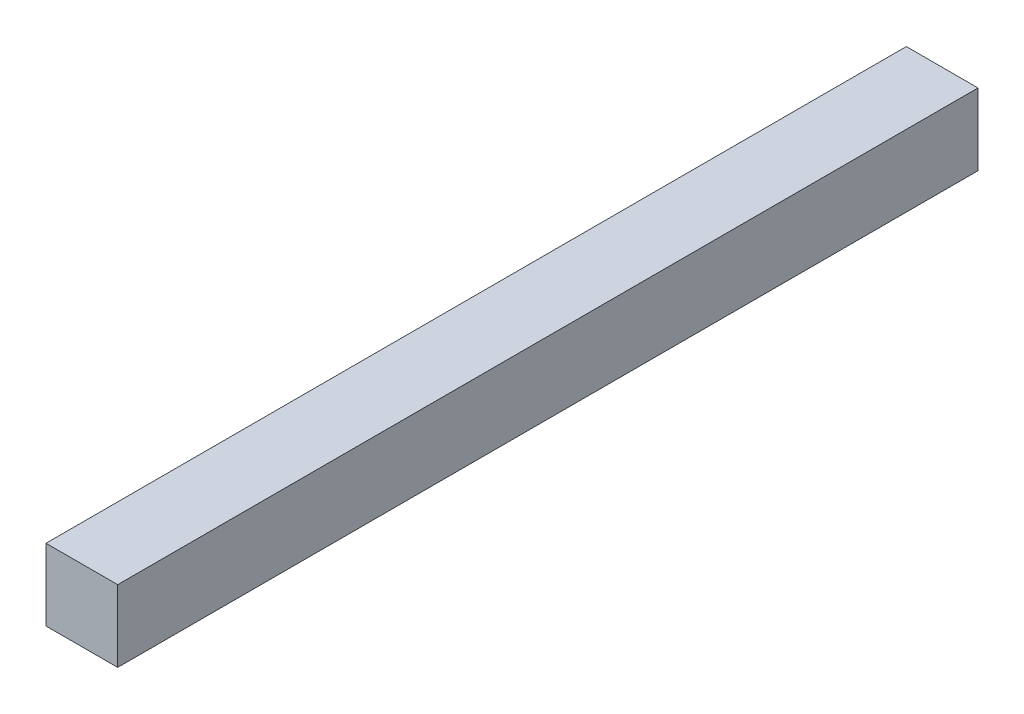
ISO-10303-21;
HEADER;
FILE_DESCRIPTION(('STEP AP214'),'2;1');
FILE_NAME('part.step','',(''),(''),'','','');
FILE_SCHEMA(('AUTOMOTIVE_DESIGN { 1 0 10303 214 1 1 1 1 }'));
ENDSEC;
DATA;
#1=APPLICATION_CONTEXT('core data for automotive mechanical design processes');
#2=APPLICATION_PROTOCOL_DEFINITION('international standard','automotive_design',2000,#1);
#3=PRODUCT_CONTEXT('',#1,'mechanical');
#4=PRODUCT('Part','Part','',(#3));
#5=PRODUCT_RELATED_PRODUCT_CATEGORY('part','',(#4));
#6=PRODUCT_DEFINITION_FORMATION('','',#4);
#7=PRODUCT_DEFINITION_CONTEXT('part definition',#1,'design');
#8=PRODUCT_DEFINITION('design','',#6,#7);
#9=PRODUCT_DEFINITION_SHAPE('','',#8);
#10=(LENGTH_UNIT() NAMED_UNIT(*) SI_UNIT(.MILLI.,.METRE.));
#11=(NAMED_UNIT(*) PLANE_ANGLE_UNIT() SI_UNIT($,.RADIAN.));
#12=(NAMED_UNIT(*) SI_UNIT($,.STERADIAN.) SOLID_ANGLE_UNIT());
#13=UNCERTAINTY_MEASURE_WITH_UNIT(LENGTH_MEASURE(1.E-05),#10,'distance_accuracy_value','');
#14=(GEOMETRIC_REPRESENTATION_CONTEXT(3) GLOBAL_UNCERTAINTY_ASSIGNED_CONTEXT((#13)) GLOBAL_UNIT_ASSIGNED_CONTEXT((#10,
#11,#12)) REPRESENTATION_CONTEXT('',''));
#15=CARTESIAN_POINT('',(0.,0.,0.));
#16=DIRECTION('',(0.,0.,1.));
#17=DIRECTION('',(1.,0.,0.));
#18=AXIS2_PLACEMENT_3D('',#15,#16,#17);
#19=CARTESIAN_POINT('',(-2.5,-2.5,60.));
#20=DIRECTION('',(1.,0.,0.));
#21=DIRECTION('',(0.,0.,-1.));
#22=AXIS2_PLACEMENT_3D('',#19,#20,#21);
#23=PLANE('',#22);
#24=DIRECTION('',(0.,-1.,0.));
#25=VECTOR('',#24,1.);
#26=CARTESIAN_POINT('',(-2.5,-2.5,0.));
#27=LINE('',#26,#25);
#28=CARTESIAN_POINT('',(-2.5,2.5,0.));
#29=VERTEX_POINT('',#28);
#30=CARTESIAN_POINT('',(-2.5,-2.5,0.));
#31=VERTEX_POINT('',#30);
#32=EDGE_CURVE('E113',#29,#31,#27,.T.);
#33=ORIENTED_EDGE('',*,*,#32,.T.);
#34=DIRECTION('',(0.,0.,-1.));
#35=VECTOR('',#34,1.);
#36=CARTESIAN_POINT('',(-2.5,-2.5,60.));
#37=LINE('',#36,#35);
#38=CARTESIAN_POINT('',(-2.5,-2.5,60.));
#39=VERTEX_POINT('',#38);
#40=EDGE_CURVE('E11',#39,#31,#37,.T.);
#41=ORIENTED_EDGE('',*,*,#40,.F.);
#42=DIRECTION('',(0.,-1.,0.));
#43=VECTOR('',#42,1.);
#44=CARTESIAN_POINT('',(-2.5,-2.5,60.));
#45=LINE('',#44,#43);
#46=CARTESIAN_POINT('',(-2.5,2.5,60.));
#47=VERTEX_POINT('',#46);
#48=EDGE_CURVE('E97',#47,#39,#45,.T.);
#49=ORIENTED_EDGE('',*,*,#48,.F.);
#50=DIRECTION('',(0.,0.,-1.));
#51=VECTOR('',#50,1.);
#52=CARTESIAN_POINT('',(-2.5,2.5,60.));
#53=LINE('',#52,#51);
#54=EDGE_CURVE('E109',#47,#29,#53,.T.);
#55=ORIENTED_EDGE('',*,*,#54,.T.);
#56=EDGE_LOOP('',(#33,#41,#49,#55));
#57=FACE_BOUND('',#56,.T.);
#58=ADVANCED_FACE('F45',(#57),#23,.F.);
#59=CARTESIAN_POINT('',(2.5,-2.5,60.));
#60=DIRECTION('',(0.,1.,0.));
#61=DIRECTION('',(-1.,0.,0.));
#62=AXIS2_PLACEMENT_3D('',#59,#60,#61);
#63=PLANE('',#62);
#64=DIRECTION('',(1.,0.,0.));
#65=VECTOR('',#64,1.);
#66=CARTESIAN_POINT('',(2.5,-2.5,0.));
#67=LINE('',#66,#65);
#68=CARTESIAN_POINT('',(2.5,-2.5,0.));
#69=VERTEX_POINT('',#68);
#70=EDGE_CURVE('E102',#31,#69,#67,.T.);
#71=ORIENTED_EDGE('',*,*,#70,.T.);
#72=DIRECTION('',(0.,0.,-1.));
#73=VECTOR('',#72,1.);
#74=CARTESIAN_POINT('',(2.5,-2.5,60.));
#75=LINE('',#74,#73);
#76=CARTESIAN_POINT('',(2.5,-2.5,60.));
#77=VERTEX_POINT('',#76);
#78=EDGE_CURVE('E54',#77,#69,#75,.T.);
#79=ORIENTED_EDGE('',*,*,#78,.F.);
#80=DIRECTION('',(1.,0.,0.));
#81=VECTOR('',#80,1.);
#82=CARTESIAN_POINT('',(2.5,-2.5,60.));
#83=LINE('',#82,#81);
#84=EDGE_CURVE('E92',#39,#77,#83,.T.);
#85=ORIENTED_EDGE('',*,*,#84,.F.);
#86=ORIENTED_EDGE('',*,*,#40,.T.);
#87=EDGE_LOOP('',(#71,#79,#85,#86));
#88=FACE_BOUND('',#87,.T.);
#89=ADVANCED_FACE('F101',(#88),#63,.F.);
#90=CARTESIAN_POINT('',(2.5,-2.5,60.));
#91=DIRECTION('',(-1.,0.,0.));
#92=DIRECTION('',(0.,0.,1.));
#93=AXIS2_PLACEMENT_3D('',#90,#91,#92);
#94=PLANE('',#93);
#95=DIRECTION('',(0.,1.,0.));
#96=VECTOR('',#95,1.);
#97=CARTESIAN_POINT('',(2.5,-2.5,0.));
#98=LINE('',#97,#96);
#99=CARTESIAN_POINT('',(2.5,2.5,0.));
#100=VERTEX_POINT('',#99);
#101=EDGE_CURVE('E79',#69,#100,#98,.T.);
#102=ORIENTED_EDGE('',*,*,#101,.T.);
#103=DIRECTION('',(0.,0.,-1.));
#104=VECTOR('',#103,1.);
#105=CARTESIAN_POINT('',(2.5,2.5,60.));
#106=LINE('',#105,#104);
#107=CARTESIAN_POINT('',(2.5,2.5,60.));
#108=VERTEX_POINT('',#107);
#109=EDGE_CURVE('E104',#108,#100,#106,.T.);
#110=ORIENTED_EDGE('',*,*,#109,.F.);
#111=DIRECTION('',(0.,1.,0.));
#112=VECTOR('',#111,1.);
#113=CARTESIAN_POINT('',(2.5,-2.5,60.));
#114=LINE('',#113,#112);
#115=EDGE_CURVE('E95',#77,#108,#114,.T.);
#116=ORIENTED_EDGE('',*,*,#115,.F.);
#117=ORIENTED_EDGE('',*,*,#78,.T.);
#118=EDGE_LOOP('',(#102,#110,#116,#117));
#119=FACE_BOUND('',#118,.T.);
#120=ADVANCED_FACE('F105',(#119),#94,.F.);
#121=CARTESIAN_POINT('',(2.5,2.5,60.));
#122=DIRECTION('',(0.,-1.,0.));
#123=DIRECTION('',(1.,0.,0.));
#124=AXIS2_PLACEMENT_3D('',#121,#122,#123);
#125=PLANE('',#124);
#126=DIRECTION('',(-1.,0.,0.));
#127=VECTOR('',#126,1.);
#128=CARTESIAN_POINT('',(2.5,2.5,0.));
#129=LINE('',#128,#127);
#130=EDGE_CURVE('E85',#100,#29,#129,.T.);
#131=ORIENTED_EDGE('',*,*,#130,.T.);
#132=ORIENTED_EDGE('',*,*,#54,.F.);
#133=DIRECTION('',(-1.,0.,0.));
#134=VECTOR('',#133,1.);
#135=CARTESIAN_POINT('',(2.5,2.5,60.));
#136=LINE('',#135,#134);
#137=EDGE_CURVE('E62',#108,#47,#136,.T.);
#138=ORIENTED_EDGE('',*,*,#137,.F.);
#139=ORIENTED_EDGE('',*,*,#109,.T.);
#140=EDGE_LOOP('',(#131,#132,#138,#139));
#141=FACE_BOUND('',#140,.T.);
#142=ADVANCED_FACE('F126',(#141),#125,.F.);
#143=CARTESIAN_POINT('',(0.,0.,60.));
#144=DIRECTION('',(0.,0.,1.));
#145=DIRECTION('',(1.,0.,0.));
#146=AXIS2_PLACEMENT_3D('',#143,#144,#145);
#147=PLANE('',#146);
#148=ORIENTED_EDGE('',*,*,#48,.T.);
#149=ORIENTED_EDGE('',*,*,#84,.T.);
#150=ORIENTED_EDGE('',*,*,#115,.T.);
#151=ORIENTED_EDGE('',*,*,#137,.T.);
#152=EDGE_LOOP('',(#148,#149,#150,#151));
#153=FACE_BOUND('',#152,.T.);
#154=ADVANCED_FACE('F93',(#153),#147,.T.);
#155=CARTESIAN_POINT('',(0.,0.,0.));
#156=DIRECTION('',(0.,0.,1.));
#157=DIRECTION('',(1.,0.,0.));
#158=AXIS2_PLACEMENT_3D('',#155,#156,#157);
#159=PLANE('',#158);
#160=ORIENTED_EDGE('',*,*,#32,.F.);
#161=ORIENTED_EDGE('',*,*,#130,.F.);
#162=ORIENTED_EDGE('',*,*,#101,.F.);
#163=ORIENTED_EDGE('',*,*,#70,.F.);
#164=EDGE_LOOP('',(#160,#161,#162,#163));
#165=FACE_BOUND('',#164,.T.);
#166=ADVANCED_FACE('F129',(#165),#159,.F.);
#167=CLOSED_SHELL('',(#58,#89,#120,#142,#154,#166));
#168=MANIFOLD_SOLID_BREP('B2',#167);
#169=ADVANCED_BREP_SHAPE_REPRESENTATION('',(#18,#168),#14);
#170=SHAPE_DEFINITION_REPRESENTATION(#9,#169);
ENDSEC;
END-ISO-10303-21;
